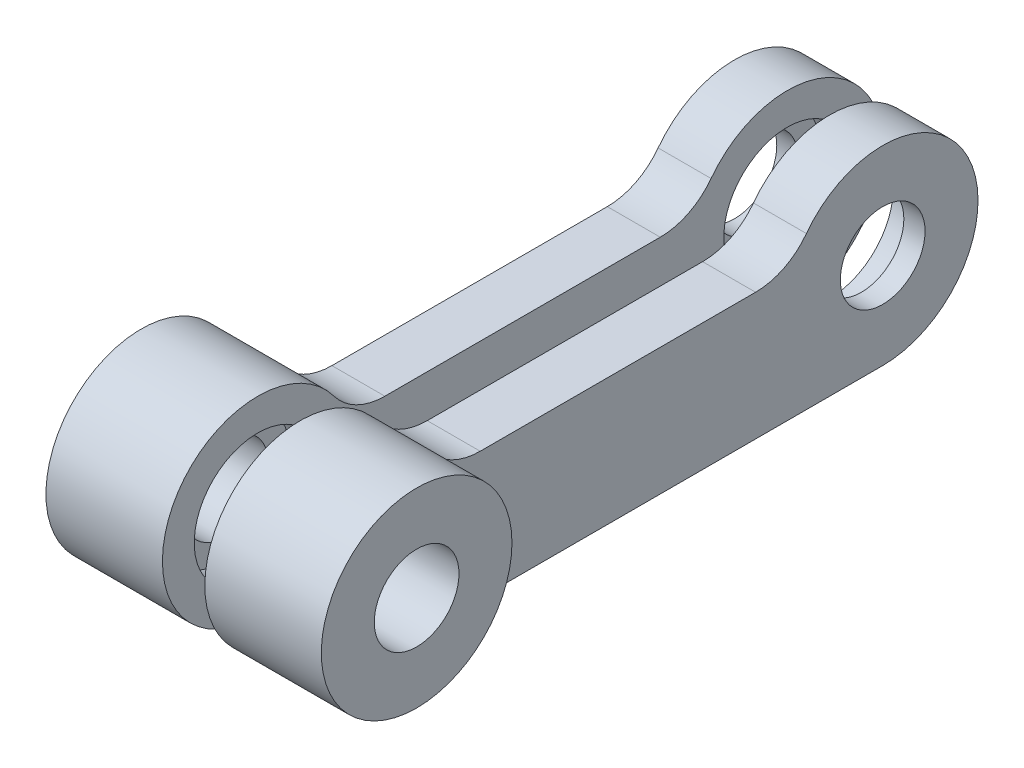
ISO-10303-21;
HEADER;
FILE_DESCRIPTION(('STEP AP214'),'2;1');
FILE_NAME('part.step','',(''),(''),'','','');
FILE_SCHEMA(('AUTOMOTIVE_DESIGN { 1 0 10303 214 1 1 1 1 }'));
ENDSEC;
DATA;
#1=APPLICATION_CONTEXT('core data for automotive mechanical design processes');
#2=APPLICATION_PROTOCOL_DEFINITION('international standard','automotive_design',2000,#1);
#3=PRODUCT_CONTEXT('',#1,'mechanical');
#4=PRODUCT('Part','Part','',(#3));
#5=PRODUCT_RELATED_PRODUCT_CATEGORY('part','',(#4));
#6=PRODUCT_DEFINITION_FORMATION('','',#4);
#7=PRODUCT_DEFINITION_CONTEXT('part definition',#1,'design');
#8=PRODUCT_DEFINITION('design','',#6,#7);
#9=PRODUCT_DEFINITION_SHAPE('','',#8);
#10=(LENGTH_UNIT() NAMED_UNIT(*) SI_UNIT(.MILLI.,.METRE.));
#11=(NAMED_UNIT(*) PLANE_ANGLE_UNIT() SI_UNIT($,.RADIAN.));
#12=(NAMED_UNIT(*) SI_UNIT($,.STERADIAN.) SOLID_ANGLE_UNIT());
#13=UNCERTAINTY_MEASURE_WITH_UNIT(LENGTH_MEASURE(1.E-05),#10,'distance_accuracy_value','');
#14=(GEOMETRIC_REPRESENTATION_CONTEXT(3) GLOBAL_UNCERTAINTY_ASSIGNED_CONTEXT((#13)) GLOBAL_UNIT_ASSIGNED_CONTEXT((#10,
#11,#12)) REPRESENTATION_CONTEXT('',''));
#15=CARTESIAN_POINT('',(0.,0.,0.));
#16=DIRECTION('',(0.,0.,1.));
#17=DIRECTION('',(1.,0.,0.));
#18=AXIS2_PLACEMENT_3D('',#15,#16,#17);
#19=CARTESIAN_POINT('',(4.5,-1.5,0.));
#20=DIRECTION('',(1.,0.,0.));
#21=DIRECTION('',(0.,0.,1.));
#22=AXIS2_PLACEMENT_3D('',#19,#20,#21);
#23=CYLINDRICAL_SURFACE('',#22,2.);
#24=CARTESIAN_POINT('',(10.,-1.5,0.));
#25=DIRECTION('',(1.,0.,0.));
#26=DIRECTION('',(0.,0.,-1.));
#27=AXIS2_PLACEMENT_3D('',#24,#25,#26);
#28=CIRCLE('',#27,2.);
#29=CARTESIAN_POINT('',(10.,-1.5,-2.));
#30=VERTEX_POINT('',#29);
#31=EDGE_CURVE('E167',#30,#30,#28,.T.);
#32=ORIENTED_EDGE('',*,*,#31,.T.);
#33=EDGE_LOOP('',(#32));
#34=FACE_BOUND('',#33,.T.);
#35=CARTESIAN_POINT('',(6.,-1.5,0.));
#36=DIRECTION('',(1.,0.,0.));
#37=DIRECTION('',(0.,0.,-1.));
#38=AXIS2_PLACEMENT_3D('',#35,#36,#37);
#39=CIRCLE('',#38,2.);
#40=CARTESIAN_POINT('',(6.,-1.5,-2.));
#41=VERTEX_POINT('',#40);
#42=EDGE_CURVE('E77',#41,#41,#39,.T.);
#43=ORIENTED_EDGE('',*,*,#42,.F.);
#44=EDGE_LOOP('',(#43));
#45=FACE_BOUND('',#44,.T.);
#46=ADVANCED_FACE('F73',(#34,#45),#23,.F.);
#47=CARTESIAN_POINT('',(4.5,-1.5,-25.));
#48=DIRECTION('',(1.,0.,0.));
#49=DIRECTION('',(0.,0.,1.));
#50=AXIS2_PLACEMENT_3D('',#47,#48,#49);
#51=CYLINDRICAL_SURFACE('',#50,2.);
#52=CARTESIAN_POINT('',(7.,-1.5,-25.));
#53=DIRECTION('',(1.,0.,0.));
#54=DIRECTION('',(0.,0.,-1.));
#55=AXIS2_PLACEMENT_3D('',#52,#53,#54);
#56=CIRCLE('',#55,2.);
#57=CARTESIAN_POINT('',(7.,-1.5,-27.));
#58=VERTEX_POINT('',#57);
#59=EDGE_CURVE('E164',#58,#58,#56,.F.);
#60=ORIENTED_EDGE('',*,*,#59,.F.);
#61=EDGE_LOOP('',(#60));
#62=FACE_BOUND('',#61,.T.);
#63=CARTESIAN_POINT('',(6.,-1.5,-25.));
#64=DIRECTION('',(1.,0.,0.));
#65=DIRECTION('',(0.,0.,-1.));
#66=AXIS2_PLACEMENT_3D('',#63,#64,#65);
#67=CIRCLE('',#66,2.);
#68=CARTESIAN_POINT('',(6.,-1.5,-27.));
#69=VERTEX_POINT('',#68);
#70=EDGE_CURVE('E180',#69,#69,#67,.T.);
#71=ORIENTED_EDGE('',*,*,#70,.F.);
#72=EDGE_LOOP('',(#71));
#73=FACE_BOUND('',#72,.T.);
#74=ADVANCED_FACE('F216',(#62,#73),#51,.F.);
#75=CARTESIAN_POINT('',(4.5,-1.5,0.));
#76=DIRECTION('',(-1.,0.,0.));
#77=DIRECTION('',(0.,0.,-1.));
#78=AXIS2_PLACEMENT_3D('',#75,#76,#77);
#79=PLANE('',#78);
#80=CARTESIAN_POINT('',(4.5,-1.5,0.));
#81=DIRECTION('',(1.,0.,0.));
#82=DIRECTION('',(0.,0.,-1.));
#83=AXIS2_PLACEMENT_3D('',#80,#81,#82);
#84=CIRCLE('',#83,3.);
#85=CARTESIAN_POINT('',(4.5,-1.5,-3.));
#86=VERTEX_POINT('',#85);
#87=EDGE_CURVE('E187',#86,#86,#84,.T.);
#88=ORIENTED_EDGE('',*,*,#87,.T.);
#89=EDGE_LOOP('',(#88));
#90=FACE_BOUND('',#89,.T.);
#91=CARTESIAN_POINT('',(4.5,-1.5,-25.));
#92=DIRECTION('',(1.,0.,0.));
#93=DIRECTION('',(0.,0.,-1.));
#94=AXIS2_PLACEMENT_3D('',#91,#92,#93);
#95=CIRCLE('',#94,3.);
#96=CARTESIAN_POINT('',(4.5,-1.5,-28.));
#97=VERTEX_POINT('',#96);
#98=EDGE_CURVE('E197',#97,#97,#95,.T.);
#99=ORIENTED_EDGE('',*,*,#98,.T.);
#100=EDGE_LOOP('',(#99));
#101=FACE_BOUND('',#100,.T.);
#102=DIRECTION('',(0.,0.,-1.));
#103=VECTOR('',#102,1.);
#104=CARTESIAN_POINT('',(4.5,-6.,0.));
#105=LINE('',#104,#103);
#106=CARTESIAN_POINT('',(4.5,-6.,0.));
#107=VERTEX_POINT('',#106);
#108=CARTESIAN_POINT('',(4.5,-6.,-25.));
#109=VERTEX_POINT('',#108);
#110=EDGE_CURVE('E151',#107,#109,#105,.T.);
#111=ORIENTED_EDGE('',*,*,#110,.F.);
#112=CARTESIAN_POINT('',(4.5,-1.5,0.));
#113=DIRECTION('',(1.,0.,0.));
#114=DIRECTION('',(0.,0.,-1.));
#115=AXIS2_PLACEMENT_3D('',#112,#113,#114);
#116=CIRCLE('',#115,4.5);
#117=CARTESIAN_POINT('',(4.5,1.2,-3.6));
#118=VERTEX_POINT('',#117);
#119=EDGE_CURVE('E146',#118,#107,#116,.T.);
#120=ORIENTED_EDGE('',*,*,#119,.F.);
#121=CARTESIAN_POINT('',(4.5,3.,-6.));
#122=DIRECTION('',(1.,0.,0.));
#123=DIRECTION('',(0.,0.,-1.));
#124=AXIS2_PLACEMENT_3D('',#121,#122,#123);
#125=CIRCLE('',#124,3.);
#126=CARTESIAN_POINT('',(4.5,0.,-6.));
#127=VERTEX_POINT('',#126);
#128=EDGE_CURVE('E13',#127,#118,#125,.F.);
#129=ORIENTED_EDGE('',*,*,#128,.F.);
#130=DIRECTION('',(0.,0.,-1.));
#131=VECTOR('',#130,1.);
#132=CARTESIAN_POINT('',(4.5,0.,0.));
#133=LINE('',#132,#131);
#134=CARTESIAN_POINT('',(4.5,0.,-19.));
#135=VERTEX_POINT('',#134);
#136=EDGE_CURVE('E153',#127,#135,#133,.T.);
#137=ORIENTED_EDGE('',*,*,#136,.T.);
#138=CARTESIAN_POINT('',(4.5,3.,-19.));
#139=DIRECTION('',(1.,0.,0.));
#140=DIRECTION('',(0.,0.,-1.));
#141=AXIS2_PLACEMENT_3D('',#138,#139,#140);
#142=CIRCLE('',#141,3.);
#143=CARTESIAN_POINT('',(4.5,1.2,-21.4));
#144=VERTEX_POINT('',#143);
#145=EDGE_CURVE('E177',#144,#135,#142,.F.);
#146=ORIENTED_EDGE('',*,*,#145,.F.);
#147=CARTESIAN_POINT('',(4.5,-1.5,-25.));
#148=DIRECTION('',(1.,0.,0.));
#149=DIRECTION('',(0.,0.,-1.));
#150=AXIS2_PLACEMENT_3D('',#147,#148,#149);
#151=CIRCLE('',#150,4.5);
#152=EDGE_CURVE('E137',#109,#144,#151,.T.);
#153=ORIENTED_EDGE('',*,*,#152,.F.);
#154=EDGE_LOOP('',(#111,#120,#129,#137,#146,#153));
#155=FACE_BOUND('',#154,.T.);
#156=ADVANCED_FACE('F207',(#90,#101,#155),#79,.T.);
#157=CARTESIAN_POINT('',(4.5,-1.5,0.));
#158=DIRECTION('',(1.,0.,0.));
#159=DIRECTION('',(0.,0.,1.));
#160=AXIS2_PLACEMENT_3D('',#157,#158,#159);
#161=CYLINDRICAL_SURFACE('',#160,4.5);
#162=ORIENTED_EDGE('',*,*,#119,.T.);
#163=DIRECTION('',(1.,0.,0.));
#164=VECTOR('',#163,1.);
#165=CARTESIAN_POINT('',(4.5,-6.,0.));
#166=LINE('',#165,#164);
#167=CARTESIAN_POINT('',(7.,-6.,0.));
#168=VERTEX_POINT('',#167);
#169=EDGE_CURVE('E132',#107,#168,#166,.T.);
#170=ORIENTED_EDGE('',*,*,#169,.T.);
#171=CARTESIAN_POINT('',(7.,-1.5,0.));
#172=DIRECTION('',(1.,0.,0.));
#173=DIRECTION('',(0.,0.,-1.));
#174=AXIS2_PLACEMENT_3D('',#171,#172,#173);
#175=CIRCLE('',#174,4.5);
#176=CARTESIAN_POINT('',(7.,1.2,-3.6));
#177=VERTEX_POINT('',#176);
#178=EDGE_CURVE('E139',#168,#177,#175,.T.);
#179=ORIENTED_EDGE('',*,*,#178,.T.);
#180=DIRECTION('',(1.,0.,0.));
#181=VECTOR('',#180,1.);
#182=CARTESIAN_POINT('',(4.5,1.2,-3.6));
#183=LINE('',#182,#181);
#184=EDGE_CURVE('E96',#118,#177,#183,.T.);
#185=ORIENTED_EDGE('',*,*,#184,.F.);
#186=EDGE_LOOP('',(#162,#170,#179,#185));
#187=FACE_BOUND('',#186,.T.);
#188=CARTESIAN_POINT('',(10.,-1.5,0.));
#189=DIRECTION('',(1.,0.,0.));
#190=DIRECTION('',(0.,0.,-1.));
#191=AXIS2_PLACEMENT_3D('',#188,#189,#190);
#192=CIRCLE('',#191,4.5);
#193=CARTESIAN_POINT('',(10.,-1.5,-4.5));
#194=VERTEX_POINT('',#193);
#195=EDGE_CURVE('E163',#194,#194,#192,.T.);
#196=ORIENTED_EDGE('',*,*,#195,.F.);
#197=EDGE_LOOP('',(#196));
#198=FACE_BOUND('',#197,.T.);
#199=ADVANCED_FACE('F143',(#187,#198),#161,.T.);
#200=CARTESIAN_POINT('',(7.,-1.5,0.));
#201=DIRECTION('',(-1.,0.,0.));
#202=DIRECTION('',(0.,0.,-1.));
#203=AXIS2_PLACEMENT_3D('',#200,#201,#202);
#204=PLANE('',#203);
#205=ORIENTED_EDGE('',*,*,#59,.T.);
#206=EDGE_LOOP('',(#205));
#207=FACE_BOUND('',#206,.T.);
#208=DIRECTION('',(0.,0.,-1.));
#209=VECTOR('',#208,1.);
#210=CARTESIAN_POINT('',(7.,-6.,0.));
#211=LINE('',#210,#209);
#212=CARTESIAN_POINT('',(7.,-6.,-25.));
#213=VERTEX_POINT('',#212);
#214=EDGE_CURVE('E128',#168,#213,#211,.T.);
#215=ORIENTED_EDGE('',*,*,#214,.T.);
#216=CARTESIAN_POINT('',(7.,-1.5,-25.));
#217=DIRECTION('',(1.,0.,0.));
#218=DIRECTION('',(0.,0.,-1.));
#219=AXIS2_PLACEMENT_3D('',#216,#217,#218);
#220=CIRCLE('',#219,4.5);
#221=CARTESIAN_POINT('',(7.,1.2,-21.4));
#222=VERTEX_POINT('',#221);
#223=EDGE_CURVE('E161',#213,#222,#220,.T.);
#224=ORIENTED_EDGE('',*,*,#223,.T.);
#225=CARTESIAN_POINT('',(7.,3.,-19.));
#226=DIRECTION('',(1.,0.,0.));
#227=DIRECTION('',(0.,0.,-1.));
#228=AXIS2_PLACEMENT_3D('',#225,#226,#227);
#229=CIRCLE('',#228,3.);
#230=CARTESIAN_POINT('',(7.,0.,-19.));
#231=VERTEX_POINT('',#230);
#232=EDGE_CURVE('E174',#231,#222,#229,.T.);
#233=ORIENTED_EDGE('',*,*,#232,.F.);
#234=DIRECTION('',(0.,0.,-1.));
#235=VECTOR('',#234,1.);
#236=CARTESIAN_POINT('',(7.,0.,0.));
#237=LINE('',#236,#235);
#238=CARTESIAN_POINT('',(7.,0.,-6.));
#239=VERTEX_POINT('',#238);
#240=EDGE_CURVE('E136',#239,#231,#237,.T.);
#241=ORIENTED_EDGE('',*,*,#240,.F.);
#242=CARTESIAN_POINT('',(7.,3.,-6.));
#243=DIRECTION('',(1.,0.,0.));
#244=DIRECTION('',(0.,0.,-1.));
#245=AXIS2_PLACEMENT_3D('',#242,#243,#244);
#246=CIRCLE('',#245,3.);
#247=EDGE_CURVE('E82',#177,#239,#246,.T.);
#248=ORIENTED_EDGE('',*,*,#247,.F.);
#249=ORIENTED_EDGE('',*,*,#178,.F.);
#250=EDGE_LOOP('',(#215,#224,#233,#241,#248,#249));
#251=FACE_BOUND('',#250,.T.);
#252=ADVANCED_FACE('F140',(#207,#251),#204,.F.);
#253=CARTESIAN_POINT('',(4.5,-1.5,-25.));
#254=DIRECTION('',(1.,0.,0.));
#255=DIRECTION('',(0.,0.,1.));
#256=AXIS2_PLACEMENT_3D('',#253,#254,#255);
#257=CYLINDRICAL_SURFACE('',#256,4.5);
#258=ORIENTED_EDGE('',*,*,#223,.F.);
#259=DIRECTION('',(1.,0.,0.));
#260=VECTOR('',#259,1.);
#261=CARTESIAN_POINT('',(4.5,-6.,-25.));
#262=LINE('',#261,#260);
#263=EDGE_CURVE('E133',#109,#213,#262,.T.);
#264=ORIENTED_EDGE('',*,*,#263,.F.);
#265=ORIENTED_EDGE('',*,*,#152,.T.);
#266=DIRECTION('',(1.,0.,0.));
#267=VECTOR('',#266,1.);
#268=CARTESIAN_POINT('',(4.5,1.2,-21.4));
#269=LINE('',#268,#267);
#270=EDGE_CURVE('E171',#222,#144,#269,.F.);
#271=ORIENTED_EDGE('',*,*,#270,.F.);
#272=EDGE_LOOP('',(#258,#264,#265,#271));
#273=FACE_BOUND('',#272,.T.);
#274=ADVANCED_FACE('F213',(#273),#257,.T.);
#275=CARTESIAN_POINT('',(4.5,0.,0.));
#276=DIRECTION('',(0.,1.,0.));
#277=DIRECTION('',(0.,0.,1.));
#278=AXIS2_PLACEMENT_3D('',#275,#276,#277);
#279=PLANE('',#278);
#280=ORIENTED_EDGE('',*,*,#136,.F.);
#281=DIRECTION('',(1.,0.,0.));
#282=VECTOR('',#281,1.);
#283=CARTESIAN_POINT('',(4.5,0.,-6.));
#284=LINE('',#283,#282);
#285=EDGE_CURVE('E141',#239,#127,#284,.F.);
#286=ORIENTED_EDGE('',*,*,#285,.F.);
#287=ORIENTED_EDGE('',*,*,#240,.T.);
#288=DIRECTION('',(1.,0.,0.));
#289=VECTOR('',#288,1.);
#290=CARTESIAN_POINT('',(4.5,0.,-19.));
#291=LINE('',#290,#289);
#292=EDGE_CURVE('E169',#135,#231,#291,.T.);
#293=ORIENTED_EDGE('',*,*,#292,.F.);
#294=EDGE_LOOP('',(#280,#286,#287,#293));
#295=FACE_BOUND('',#294,.T.);
#296=ADVANCED_FACE('F241',(#295),#279,.T.);
#297=CARTESIAN_POINT('',(4.5,-6.,0.));
#298=DIRECTION('',(0.,1.,0.));
#299=DIRECTION('',(0.,0.,1.));
#300=AXIS2_PLACEMENT_3D('',#297,#298,#299);
#301=PLANE('',#300);
#302=ORIENTED_EDGE('',*,*,#214,.F.);
#303=ORIENTED_EDGE('',*,*,#169,.F.);
#304=ORIENTED_EDGE('',*,*,#110,.T.);
#305=ORIENTED_EDGE('',*,*,#263,.T.);
#306=EDGE_LOOP('',(#302,#303,#304,#305));
#307=FACE_BOUND('',#306,.T.);
#308=ADVANCED_FACE('F129',(#307),#301,.F.);
#309=CARTESIAN_POINT('',(10.,-1.5,0.));
#310=DIRECTION('',(-1.,0.,0.));
#311=DIRECTION('',(0.,0.,-1.));
#312=AXIS2_PLACEMENT_3D('',#309,#310,#311);
#313=PLANE('',#312);
#314=ORIENTED_EDGE('',*,*,#31,.F.);
#315=EDGE_LOOP('',(#314));
#316=FACE_BOUND('',#315,.T.);
#317=ORIENTED_EDGE('',*,*,#195,.T.);
#318=EDGE_LOOP('',(#317));
#319=FACE_BOUND('',#318,.T.);
#320=ADVANCED_FACE('F205',(#316,#319),#313,.F.);
#321=CARTESIAN_POINT('',(4.5,3.,-19.));
#322=DIRECTION('',(1.,0.,0.));
#323=DIRECTION('',(0.,0.,1.));
#324=AXIS2_PLACEMENT_3D('',#321,#322,#323);
#325=CYLINDRICAL_SURFACE('',#324,3.);
#326=ORIENTED_EDGE('',*,*,#145,.T.);
#327=ORIENTED_EDGE('',*,*,#292,.T.);
#328=ORIENTED_EDGE('',*,*,#232,.T.);
#329=ORIENTED_EDGE('',*,*,#270,.T.);
#330=EDGE_LOOP('',(#326,#327,#328,#329));
#331=FACE_BOUND('',#330,.T.);
#332=ADVANCED_FACE('F234',(#331),#325,.F.);
#333=CARTESIAN_POINT('',(4.5,3.,-6.));
#334=DIRECTION('',(1.,0.,0.));
#335=DIRECTION('',(0.,0.,1.));
#336=AXIS2_PLACEMENT_3D('',#333,#334,#335);
#337=CYLINDRICAL_SURFACE('',#336,3.);
#338=ORIENTED_EDGE('',*,*,#128,.T.);
#339=ORIENTED_EDGE('',*,*,#184,.T.);
#340=ORIENTED_EDGE('',*,*,#247,.T.);
#341=ORIENTED_EDGE('',*,*,#285,.T.);
#342=EDGE_LOOP('',(#338,#339,#340,#341));
#343=FACE_BOUND('',#342,.T.);
#344=ADVANCED_FACE('F75',(#343),#337,.F.);
#345=CARTESIAN_POINT('',(6.,-1.5,-25.));
#346=DIRECTION('',(-1.,0.,0.));
#347=DIRECTION('',(0.,0.,-1.));
#348=AXIS2_PLACEMENT_3D('',#345,#346,#347);
#349=CYLINDRICAL_SURFACE('',#348,3.);
#350=CARTESIAN_POINT('',(6.,-1.5,-25.));
#351=DIRECTION('',(1.,0.,0.));
#352=DIRECTION('',(0.,0.,-1.));
#353=AXIS2_PLACEMENT_3D('',#350,#351,#352);
#354=CIRCLE('',#353,3.);
#355=CARTESIAN_POINT('',(6.,-1.5,-28.));
#356=VERTEX_POINT('',#355);
#357=EDGE_CURVE('E192',#356,#356,#354,.T.);
#358=ORIENTED_EDGE('',*,*,#357,.T.);
#359=EDGE_LOOP('',(#358));
#360=FACE_BOUND('',#359,.T.);
#361=ORIENTED_EDGE('',*,*,#98,.F.);
#362=EDGE_LOOP('',(#361));
#363=FACE_BOUND('',#362,.T.);
#364=ADVANCED_FACE('F230',(#360,#363),#349,.F.);
#365=CARTESIAN_POINT('',(6.,-1.5,-25.));
#366=DIRECTION('',(-1.,0.,0.));
#367=DIRECTION('',(0.,0.,-1.));
#368=AXIS2_PLACEMENT_3D('',#365,#366,#367);
#369=PLANE('',#368);
#370=ORIENTED_EDGE('',*,*,#70,.T.);
#371=EDGE_LOOP('',(#370));
#372=FACE_BOUND('',#371,.T.);
#373=ORIENTED_EDGE('',*,*,#357,.F.);
#374=EDGE_LOOP('',(#373));
#375=FACE_BOUND('',#374,.T.);
#376=ADVANCED_FACE('F264',(#372,#375),#369,.T.);
#377=CARTESIAN_POINT('',(6.,-1.5,0.));
#378=DIRECTION('',(-1.,0.,0.));
#379=DIRECTION('',(0.,0.,-1.));
#380=AXIS2_PLACEMENT_3D('',#377,#378,#379);
#381=CYLINDRICAL_SURFACE('',#380,3.);
#382=CARTESIAN_POINT('',(6.,-1.5,0.));
#383=DIRECTION('',(1.,0.,0.));
#384=DIRECTION('',(0.,0.,-1.));
#385=AXIS2_PLACEMENT_3D('',#382,#383,#384);
#386=CIRCLE('',#385,3.);
#387=CARTESIAN_POINT('',(6.,-1.5,-3.));
#388=VERTEX_POINT('',#387);
#389=EDGE_CURVE('E182',#388,#388,#386,.T.);
#390=ORIENTED_EDGE('',*,*,#389,.T.);
#391=EDGE_LOOP('',(#390));
#392=FACE_BOUND('',#391,.T.);
#393=ORIENTED_EDGE('',*,*,#87,.F.);
#394=EDGE_LOOP('',(#393));
#395=FACE_BOUND('',#394,.T.);
#396=ADVANCED_FACE('F269',(#392,#395),#381,.F.);
#397=CARTESIAN_POINT('',(6.,-1.5,0.));
#398=DIRECTION('',(-1.,0.,0.));
#399=DIRECTION('',(0.,0.,-1.));
#400=AXIS2_PLACEMENT_3D('',#397,#398,#399);
#401=PLANE('',#400);
#402=ORIENTED_EDGE('',*,*,#42,.T.);
#403=EDGE_LOOP('',(#402));
#404=FACE_BOUND('',#403,.T.);
#405=ORIENTED_EDGE('',*,*,#389,.F.);
#406=EDGE_LOOP('',(#405));
#407=FACE_BOUND('',#406,.T.);
#408=ADVANCED_FACE('F278',(#404,#407),#401,.T.);
#409=CLOSED_SHELL('',(#46,#74,#156,#199,#252,#274,#296,#308,#320,#332,#344,#364,#376,#396,#408));
#410=MANIFOLD_SOLID_BREP('B2',#409);
#411=CARTESIAN_POINT('',(2.5,-1.5,0.));
#412=DIRECTION('',(-1.,0.,0.));
#413=DIRECTION('',(0.,0.,1.));
#414=AXIS2_PLACEMENT_3D('',#411,#412,#413);
#415=CYLINDRICAL_SURFACE('',#414,2.);
#416=CARTESIAN_POINT('',(-3.,-1.5,0.));
#417=DIRECTION('',(1.,0.,0.));
#418=DIRECTION('',(0.,0.,-1.));
#419=AXIS2_PLACEMENT_3D('',#416,#417,#418);
#420=CIRCLE('',#419,2.);
#421=CARTESIAN_POINT('',(-3.,-1.5,-2.));
#422=VERTEX_POINT('',#421);
#423=EDGE_CURVE('E462',#422,#422,#420,.T.);
#424=ORIENTED_EDGE('',*,*,#423,.F.);
#425=EDGE_LOOP('',(#424));
#426=FACE_BOUND('',#425,.T.);
#427=CARTESIAN_POINT('',(1.,-1.5,0.));
#428=DIRECTION('',(1.,0.,0.));
#429=DIRECTION('',(0.,0.,-1.));
#430=AXIS2_PLACEMENT_3D('',#427,#428,#429);
#431=CIRCLE('',#430,2.);
#432=CARTESIAN_POINT('',(1.,-1.5,-2.));
#433=VERTEX_POINT('',#432);
#434=EDGE_CURVE('E373',#433,#433,#431,.T.);
#435=ORIENTED_EDGE('',*,*,#434,.T.);
#436=EDGE_LOOP('',(#435));
#437=FACE_BOUND('',#436,.T.);
#438=ADVANCED_FACE('F369',(#426,#437),#415,.F.);
#439=CARTESIAN_POINT('',(2.5,-1.5,-25.));
#440=DIRECTION('',(-1.,0.,0.));
#441=DIRECTION('',(0.,0.,1.));
#442=AXIS2_PLACEMENT_3D('',#439,#440,#441);
#443=CYLINDRICAL_SURFACE('',#442,2.);
#444=CARTESIAN_POINT('',(0.,-1.5,-25.));
#445=DIRECTION('',(1.,0.,0.));
#446=DIRECTION('',(0.,0.,-1.));
#447=AXIS2_PLACEMENT_3D('',#444,#445,#446);
#448=CIRCLE('',#447,2.);
#449=CARTESIAN_POINT('',(0.,-1.5,-27.));
#450=VERTEX_POINT('',#449);
#451=EDGE_CURVE('E459',#450,#450,#448,.F.);
#452=ORIENTED_EDGE('',*,*,#451,.T.);
#453=EDGE_LOOP('',(#452));
#454=FACE_BOUND('',#453,.T.);
#455=CARTESIAN_POINT('',(1.,-1.5,-25.));
#456=DIRECTION('',(1.,0.,0.));
#457=DIRECTION('',(0.,0.,-1.));
#458=AXIS2_PLACEMENT_3D('',#455,#456,#457);
#459=CIRCLE('',#458,2.);
#460=CARTESIAN_POINT('',(1.,-1.5,-27.));
#461=VERTEX_POINT('',#460);
#462=EDGE_CURVE('E474',#461,#461,#459,.T.);
#463=ORIENTED_EDGE('',*,*,#462,.T.);
#464=EDGE_LOOP('',(#463));
#465=FACE_BOUND('',#464,.T.);
#466=ADVANCED_FACE('F513',(#454,#465),#443,.F.);
#467=CARTESIAN_POINT('',(2.5,-1.5,0.));
#468=DIRECTION('',(1.,0.,0.));
#469=DIRECTION('',(0.,0.,-1.));
#470=AXIS2_PLACEMENT_3D('',#467,#468,#469);
#471=PLANE('',#470);
#472=CARTESIAN_POINT('',(2.5,-1.5,0.));
#473=DIRECTION('',(1.,0.,0.));
#474=DIRECTION('',(0.,0.,-1.));
#475=AXIS2_PLACEMENT_3D('',#472,#473,#474);
#476=CIRCLE('',#475,3.);
#477=CARTESIAN_POINT('',(2.5,-1.5,-3.));
#478=VERTEX_POINT('',#477);
#479=EDGE_CURVE('E481',#478,#478,#476,.T.);
#480=ORIENTED_EDGE('',*,*,#479,.F.);
#481=EDGE_LOOP('',(#480));
#482=FACE_BOUND('',#481,.T.);
#483=CARTESIAN_POINT('',(2.5,-1.5,-25.));
#484=DIRECTION('',(1.,0.,0.));
#485=DIRECTION('',(0.,0.,-1.));
#486=AXIS2_PLACEMENT_3D('',#483,#484,#485);
#487=CIRCLE('',#486,3.);
#488=CARTESIAN_POINT('',(2.5,-1.5,-28.));
#489=VERTEX_POINT('',#488);
#490=EDGE_CURVE('E491',#489,#489,#487,.T.);
#491=ORIENTED_EDGE('',*,*,#490,.F.);
#492=EDGE_LOOP('',(#491));
#493=FACE_BOUND('',#492,.T.);
#494=DIRECTION('',(0.,0.,-1.));
#495=VECTOR('',#494,1.);
#496=CARTESIAN_POINT('',(2.5,-6.,0.));
#497=LINE('',#496,#495);
#498=CARTESIAN_POINT('',(2.5,-6.,0.));
#499=VERTEX_POINT('',#498);
#500=CARTESIAN_POINT('',(2.5,-6.,-25.));
#501=VERTEX_POINT('',#500);
#502=EDGE_CURVE('E437',#499,#501,#497,.T.);
#503=ORIENTED_EDGE('',*,*,#502,.T.);
#504=CARTESIAN_POINT('',(2.5,-1.5,-25.));
#505=DIRECTION('',(1.,0.,0.));
#506=DIRECTION('',(0.,0.,-1.));
#507=AXIS2_PLACEMENT_3D('',#504,#505,#506);
#508=CIRCLE('',#507,4.5);
#509=CARTESIAN_POINT('',(2.5,1.2,-21.4));
#510=VERTEX_POINT('',#509);
#511=EDGE_CURVE('E445',#501,#510,#508,.T.);
#512=ORIENTED_EDGE('',*,*,#511,.T.);
#513=CARTESIAN_POINT('',(2.5,3.,-19.));
#514=DIRECTION('',(1.,0.,0.));
#515=DIRECTION('',(0.,0.,-1.));
#516=AXIS2_PLACEMENT_3D('',#513,#514,#515);
#517=CIRCLE('',#516,3.);
#518=CARTESIAN_POINT('',(2.5,0.,-19.));
#519=VERTEX_POINT('',#518);
#520=EDGE_CURVE('E472',#510,#519,#517,.F.);
#521=ORIENTED_EDGE('',*,*,#520,.T.);
#522=DIRECTION('',(0.,0.,-1.));
#523=VECTOR('',#522,1.);
#524=CARTESIAN_POINT('',(2.5,0.,0.));
#525=LINE('',#524,#523);
#526=CARTESIAN_POINT('',(2.5,0.,-6.));
#527=VERTEX_POINT('',#526);
#528=EDGE_CURVE('E452',#527,#519,#525,.T.);
#529=ORIENTED_EDGE('',*,*,#528,.F.);
#530=CARTESIAN_POINT('',(2.5,3.,-6.));
#531=DIRECTION('',(1.,0.,0.));
#532=DIRECTION('',(0.,0.,-1.));
#533=AXIS2_PLACEMENT_3D('',#530,#531,#532);
#534=CIRCLE('',#533,3.);
#535=CARTESIAN_POINT('',(2.5,1.2,-3.6));
#536=VERTEX_POINT('',#535);
#537=EDGE_CURVE('E71',#527,#536,#534,.F.);
#538=ORIENTED_EDGE('',*,*,#537,.T.);
#539=CARTESIAN_POINT('',(2.5,-1.5,0.));
#540=DIRECTION('',(1.,0.,0.));
#541=DIRECTION('',(0.,0.,-1.));
#542=AXIS2_PLACEMENT_3D('',#539,#540,#541);
#543=CIRCLE('',#542,4.5);
#544=EDGE_CURVE('E438',#536,#499,#543,.T.);
#545=ORIENTED_EDGE('',*,*,#544,.T.);
#546=EDGE_LOOP('',(#503,#512,#521,#529,#538,#545));
#547=FACE_BOUND('',#546,.T.);
#548=ADVANCED_FACE('F511',(#482,#493,#547),#471,.T.);
#549=CARTESIAN_POINT('',(2.5,-1.5,0.));
#550=DIRECTION('',(-1.,0.,0.));
#551=DIRECTION('',(0.,0.,1.));
#552=AXIS2_PLACEMENT_3D('',#549,#550,#551);
#553=CYLINDRICAL_SURFACE('',#552,4.5);
#554=ORIENTED_EDGE('',*,*,#544,.F.);
#555=DIRECTION('',(-1.,0.,0.));
#556=VECTOR('',#555,1.);
#557=CARTESIAN_POINT('',(2.5,1.2,-3.6));
#558=LINE('',#557,#556);
#559=CARTESIAN_POINT('',(0.,1.2,-3.6));
#560=VERTEX_POINT('',#559);
#561=EDGE_CURVE('E429',#536,#560,#558,.T.);
#562=ORIENTED_EDGE('',*,*,#561,.T.);
#563=CARTESIAN_POINT('',(0.,-1.5,0.));
#564=DIRECTION('',(1.,0.,0.));
#565=DIRECTION('',(0.,0.,-1.));
#566=AXIS2_PLACEMENT_3D('',#563,#564,#565);
#567=CIRCLE('',#566,4.5);
#568=CARTESIAN_POINT('',(0.,-6.,0.));
#569=VERTEX_POINT('',#568);
#570=EDGE_CURVE('E386',#569,#560,#567,.T.);
#571=ORIENTED_EDGE('',*,*,#570,.F.);
#572=DIRECTION('',(-1.,0.,0.));
#573=VECTOR('',#572,1.);
#574=CARTESIAN_POINT('',(2.5,-6.,0.));
#575=LINE('',#574,#573);
#576=EDGE_CURVE('E426',#499,#569,#575,.T.);
#577=ORIENTED_EDGE('',*,*,#576,.F.);
#578=EDGE_LOOP('',(#554,#562,#571,#577));
#579=FACE_BOUND('',#578,.T.);
#580=CARTESIAN_POINT('',(-3.,-1.5,0.));
#581=DIRECTION('',(1.,0.,0.));
#582=DIRECTION('',(0.,0.,-1.));
#583=AXIS2_PLACEMENT_3D('',#580,#581,#582);
#584=CIRCLE('',#583,4.5);
#585=CARTESIAN_POINT('',(-3.,-1.5,-4.5));
#586=VERTEX_POINT('',#585);
#587=EDGE_CURVE('E458',#586,#586,#584,.T.);
#588=ORIENTED_EDGE('',*,*,#587,.T.);
#589=EDGE_LOOP('',(#588));
#590=FACE_BOUND('',#589,.T.);
#591=ADVANCED_FACE('F424',(#579,#590),#553,.T.);
#592=CARTESIAN_POINT('',(0.,-1.5,0.));
#593=DIRECTION('',(1.,0.,0.));
#594=DIRECTION('',(0.,0.,-1.));
#595=AXIS2_PLACEMENT_3D('',#592,#593,#594);
#596=PLANE('',#595);
#597=ORIENTED_EDGE('',*,*,#451,.F.);
#598=EDGE_LOOP('',(#597));
#599=FACE_BOUND('',#598,.T.);
#600=DIRECTION('',(0.,0.,-1.));
#601=VECTOR('',#600,1.);
#602=CARTESIAN_POINT('',(0.,-6.,0.));
#603=LINE('',#602,#601);
#604=CARTESIAN_POINT('',(0.,-6.,-25.));
#605=VERTEX_POINT('',#604);
#606=EDGE_CURVE('E435',#569,#605,#603,.T.);
#607=ORIENTED_EDGE('',*,*,#606,.F.);
#608=ORIENTED_EDGE('',*,*,#570,.T.);
#609=CARTESIAN_POINT('',(0.,3.,-6.));
#610=DIRECTION('',(1.,0.,0.));
#611=DIRECTION('',(0.,0.,-1.));
#612=AXIS2_PLACEMENT_3D('',#609,#610,#611);
#613=CIRCLE('',#612,3.);
#614=CARTESIAN_POINT('',(0.,0.,-6.));
#615=VERTEX_POINT('',#614);
#616=EDGE_CURVE('E378',#560,#615,#613,.T.);
#617=ORIENTED_EDGE('',*,*,#616,.T.);
#618=DIRECTION('',(0.,0.,-1.));
#619=VECTOR('',#618,1.);
#620=CARTESIAN_POINT('',(0.,0.,0.));
#621=LINE('',#620,#619);
#622=CARTESIAN_POINT('',(0.,0.,-19.));
#623=VERTEX_POINT('',#622);
#624=EDGE_CURVE('E444',#615,#623,#621,.T.);
#625=ORIENTED_EDGE('',*,*,#624,.T.);
#626=CARTESIAN_POINT('',(0.,3.,-19.));
#627=DIRECTION('',(1.,0.,0.));
#628=DIRECTION('',(0.,0.,-1.));
#629=AXIS2_PLACEMENT_3D('',#626,#627,#628);
#630=CIRCLE('',#629,3.);
#631=CARTESIAN_POINT('',(0.,1.2,-21.4));
#632=VERTEX_POINT('',#631);
#633=EDGE_CURVE('E470',#623,#632,#630,.T.);
#634=ORIENTED_EDGE('',*,*,#633,.T.);
#635=CARTESIAN_POINT('',(0.,-1.5,-25.));
#636=DIRECTION('',(1.,0.,0.));
#637=DIRECTION('',(0.,0.,-1.));
#638=AXIS2_PLACEMENT_3D('',#635,#636,#637);
#639=CIRCLE('',#638,4.5);
#640=EDGE_CURVE('E443',#605,#632,#639,.T.);
#641=ORIENTED_EDGE('',*,*,#640,.F.);
#642=EDGE_LOOP('',(#607,#608,#617,#625,#634,#641));
#643=FACE_BOUND('',#642,.T.);
#644=ADVANCED_FACE('F441',(#599,#643),#596,.F.);
#645=CARTESIAN_POINT('',(2.5,-1.5,-25.));
#646=DIRECTION('',(-1.,0.,0.));
#647=DIRECTION('',(0.,0.,1.));
#648=AXIS2_PLACEMENT_3D('',#645,#646,#647);
#649=CYLINDRICAL_SURFACE('',#648,4.5);
#650=ORIENTED_EDGE('',*,*,#640,.T.);
#651=DIRECTION('',(-1.,0.,0.));
#652=VECTOR('',#651,1.);
#653=CARTESIAN_POINT('',(2.5,1.2,-21.4));
#654=LINE('',#653,#652);
#655=EDGE_CURVE('E467',#632,#510,#654,.F.);
#656=ORIENTED_EDGE('',*,*,#655,.T.);
#657=ORIENTED_EDGE('',*,*,#511,.F.);
#658=DIRECTION('',(-1.,0.,0.));
#659=VECTOR('',#658,1.);
#660=CARTESIAN_POINT('',(2.5,-6.,-25.));
#661=LINE('',#660,#659);
#662=EDGE_CURVE('E455',#501,#605,#661,.T.);
#663=ORIENTED_EDGE('',*,*,#662,.T.);
#664=EDGE_LOOP('',(#650,#656,#657,#663));
#665=FACE_BOUND('',#664,.T.);
#666=ADVANCED_FACE('F509',(#665),#649,.T.);
#667=CARTESIAN_POINT('',(2.5,0.,0.));
#668=DIRECTION('',(0.,1.,0.));
#669=DIRECTION('',(0.,0.,1.));
#670=AXIS2_PLACEMENT_3D('',#667,#668,#669);
#671=PLANE('',#670);
#672=ORIENTED_EDGE('',*,*,#528,.T.);
#673=DIRECTION('',(-1.,0.,0.));
#674=VECTOR('',#673,1.);
#675=CARTESIAN_POINT('',(2.5,0.,-19.));
#676=LINE('',#675,#674);
#677=EDGE_CURVE('E464',#519,#623,#676,.T.);
#678=ORIENTED_EDGE('',*,*,#677,.T.);
#679=ORIENTED_EDGE('',*,*,#624,.F.);
#680=DIRECTION('',(-1.,0.,0.));
#681=VECTOR('',#680,1.);
#682=CARTESIAN_POINT('',(2.5,0.,-6.));
#683=LINE('',#682,#681);
#684=EDGE_CURVE('E430',#615,#527,#683,.F.);
#685=ORIENTED_EDGE('',*,*,#684,.T.);
#686=EDGE_LOOP('',(#672,#678,#679,#685));
#687=FACE_BOUND('',#686,.T.);
#688=ADVANCED_FACE('F501',(#687),#671,.T.);
#689=CARTESIAN_POINT('',(2.5,-6.,0.));
#690=DIRECTION('',(0.,1.,0.));
#691=DIRECTION('',(0.,0.,1.));
#692=AXIS2_PLACEMENT_3D('',#689,#690,#691);
#693=PLANE('',#692);
#694=ORIENTED_EDGE('',*,*,#606,.T.);
#695=ORIENTED_EDGE('',*,*,#662,.F.);
#696=ORIENTED_EDGE('',*,*,#502,.F.);
#697=ORIENTED_EDGE('',*,*,#576,.T.);
#698=EDGE_LOOP('',(#694,#695,#696,#697));
#699=FACE_BOUND('',#698,.T.);
#700=ADVANCED_FACE('F434',(#699),#693,.F.);
#701=CARTESIAN_POINT('',(-3.,-1.5,0.));
#702=DIRECTION('',(1.,0.,0.));
#703=DIRECTION('',(0.,0.,-1.));
#704=AXIS2_PLACEMENT_3D('',#701,#702,#703);
#705=PLANE('',#704);
#706=ORIENTED_EDGE('',*,*,#423,.T.);
#707=EDGE_LOOP('',(#706));
#708=FACE_BOUND('',#707,.T.);
#709=ORIENTED_EDGE('',*,*,#587,.F.);
#710=EDGE_LOOP('',(#709));
#711=FACE_BOUND('',#710,.T.);
#712=ADVANCED_FACE('F516',(#708,#711),#705,.F.);
#713=CARTESIAN_POINT('',(2.5,3.,-19.));
#714=DIRECTION('',(-1.,0.,0.));
#715=DIRECTION('',(0.,0.,1.));
#716=AXIS2_PLACEMENT_3D('',#713,#714,#715);
#717=CYLINDRICAL_SURFACE('',#716,3.);
#718=ORIENTED_EDGE('',*,*,#520,.F.);
#719=ORIENTED_EDGE('',*,*,#655,.F.);
#720=ORIENTED_EDGE('',*,*,#633,.F.);
#721=ORIENTED_EDGE('',*,*,#677,.F.);
#722=EDGE_LOOP('',(#718,#719,#720,#721));
#723=FACE_BOUND('',#722,.T.);
#724=ADVANCED_FACE('F506',(#723),#717,.F.);
#725=CARTESIAN_POINT('',(2.5,3.,-6.));
#726=DIRECTION('',(-1.,0.,0.));
#727=DIRECTION('',(0.,0.,1.));
#728=AXIS2_PLACEMENT_3D('',#725,#726,#727);
#729=CYLINDRICAL_SURFACE('',#728,3.);
#730=ORIENTED_EDGE('',*,*,#537,.F.);
#731=ORIENTED_EDGE('',*,*,#684,.F.);
#732=ORIENTED_EDGE('',*,*,#616,.F.);
#733=ORIENTED_EDGE('',*,*,#561,.F.);
#734=EDGE_LOOP('',(#730,#731,#732,#733));
#735=FACE_BOUND('',#734,.T.);
#736=ADVANCED_FACE('F371',(#735),#729,.F.);
#737=CARTESIAN_POINT('',(1.,-1.5,-25.));
#738=DIRECTION('',(1.,0.,0.));
#739=DIRECTION('',(0.,0.,-1.));
#740=AXIS2_PLACEMENT_3D('',#737,#738,#739);
#741=CYLINDRICAL_SURFACE('',#740,3.);
#742=CARTESIAN_POINT('',(1.,-1.5,-25.));
#743=DIRECTION('',(1.,0.,0.));
#744=DIRECTION('',(0.,0.,-1.));
#745=AXIS2_PLACEMENT_3D('',#742,#743,#744);
#746=CIRCLE('',#745,3.);
#747=CARTESIAN_POINT('',(1.,-1.5,-28.));
#748=VERTEX_POINT('',#747);
#749=EDGE_CURVE('E486',#748,#748,#746,.T.);
#750=ORIENTED_EDGE('',*,*,#749,.F.);
#751=EDGE_LOOP('',(#750));
#752=FACE_BOUND('',#751,.T.);
#753=ORIENTED_EDGE('',*,*,#490,.T.);
#754=EDGE_LOOP('',(#753));
#755=FACE_BOUND('',#754,.T.);
#756=ADVANCED_FACE('F540',(#752,#755),#741,.F.);
#757=CARTESIAN_POINT('',(1.,-1.5,-25.));
#758=DIRECTION('',(1.,0.,0.));
#759=DIRECTION('',(0.,0.,-1.));
#760=AXIS2_PLACEMENT_3D('',#757,#758,#759);
#761=PLANE('',#760);
#762=ORIENTED_EDGE('',*,*,#462,.F.);
#763=EDGE_LOOP('',(#762));
#764=FACE_BOUND('',#763,.T.);
#765=ORIENTED_EDGE('',*,*,#749,.T.);
#766=EDGE_LOOP('',(#765));
#767=FACE_BOUND('',#766,.T.);
#768=ADVANCED_FACE('F543',(#764,#767),#761,.T.);
#769=CARTESIAN_POINT('',(1.,-1.5,0.));
#770=DIRECTION('',(1.,0.,0.));
#771=DIRECTION('',(0.,0.,-1.));
#772=AXIS2_PLACEMENT_3D('',#769,#770,#771);
#773=CYLINDRICAL_SURFACE('',#772,3.);
#774=CARTESIAN_POINT('',(1.,-1.5,0.));
#775=DIRECTION('',(1.,0.,0.));
#776=DIRECTION('',(0.,0.,-1.));
#777=AXIS2_PLACEMENT_3D('',#774,#775,#776);
#778=CIRCLE('',#777,3.);
#779=CARTESIAN_POINT('',(1.,-1.5,-3.));
#780=VERTEX_POINT('',#779);
#781=EDGE_CURVE('E476',#780,#780,#778,.T.);
#782=ORIENTED_EDGE('',*,*,#781,.F.);
#783=EDGE_LOOP('',(#782));
#784=FACE_BOUND('',#783,.T.);
#785=ORIENTED_EDGE('',*,*,#479,.T.);
#786=EDGE_LOOP('',(#785));
#787=FACE_BOUND('',#786,.T.);
#788=ADVANCED_FACE('F547',(#784,#787),#773,.F.);
#789=CARTESIAN_POINT('',(1.,-1.5,0.));
#790=DIRECTION('',(1.,0.,0.));
#791=DIRECTION('',(0.,0.,-1.));
#792=AXIS2_PLACEMENT_3D('',#789,#790,#791);
#793=PLANE('',#792);
#794=ORIENTED_EDGE('',*,*,#434,.F.);
#795=EDGE_LOOP('',(#794));
#796=FACE_BOUND('',#795,.T.);
#797=ORIENTED_EDGE('',*,*,#781,.T.);
#798=EDGE_LOOP('',(#797));
#799=FACE_BOUND('',#798,.T.);
#800=ADVANCED_FACE('F551',(#796,#799),#793,.T.);
#801=CLOSED_SHELL('',(#438,#466,#548,#591,#644,#666,#688,#700,#712,#724,#736,#756,#768,#788,#800));
#802=MANIFOLD_SOLID_BREP('B7',#801);
#803=ADVANCED_BREP_SHAPE_REPRESENTATION('',(#18,#410,#802),#14);
#804=SHAPE_DEFINITION_REPRESENTATION(#9,#803);
ENDSEC;
END-ISO-10303-21;
